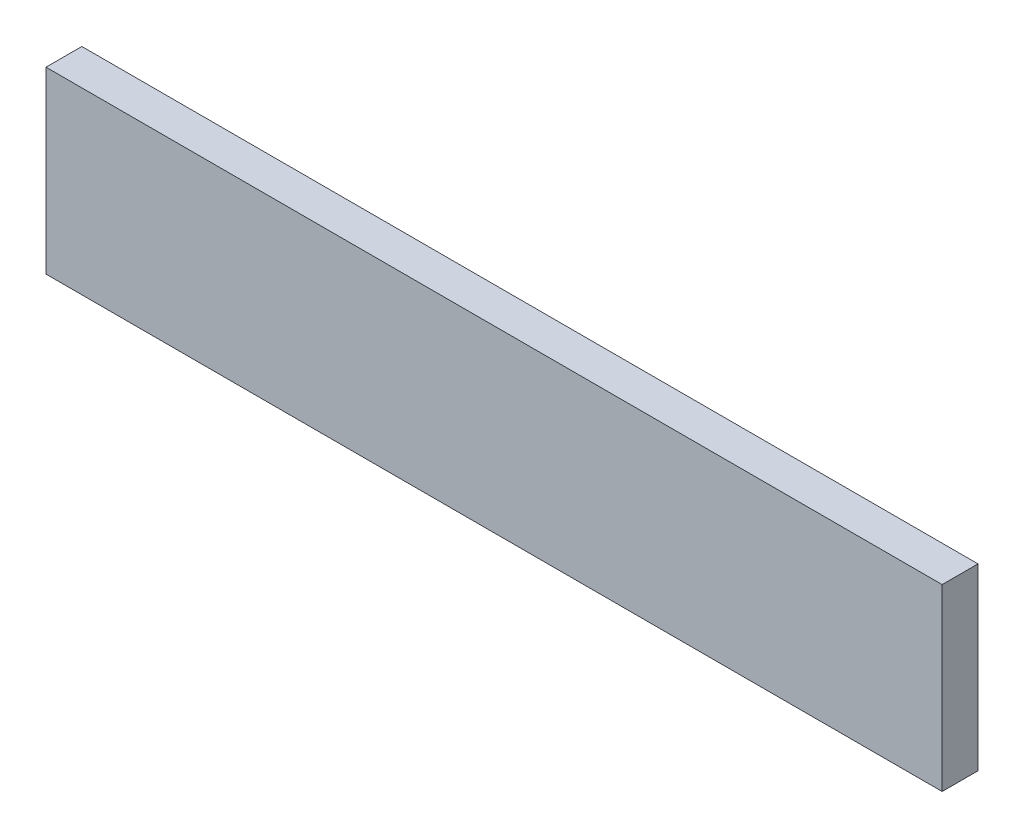
ISO-10303-21;
HEADER;
FILE_DESCRIPTION(('STEP AP214'),'2;1');
FILE_NAME('part.step','',(''),(''),'','','');
FILE_SCHEMA(('AUTOMOTIVE_DESIGN { 1 0 10303 214 1 1 1 1 }'));
ENDSEC;
DATA;
#1=APPLICATION_CONTEXT('core data for automotive mechanical design processes');
#2=APPLICATION_PROTOCOL_DEFINITION('international standard','automotive_design',2000,#1);
#3=PRODUCT_CONTEXT('',#1,'mechanical');
#4=PRODUCT('Part','Part','',(#3));
#5=PRODUCT_RELATED_PRODUCT_CATEGORY('part','',(#4));
#6=PRODUCT_DEFINITION_FORMATION('','',#4);
#7=PRODUCT_DEFINITION_CONTEXT('part definition',#1,'design');
#8=PRODUCT_DEFINITION('design','',#6,#7);
#9=PRODUCT_DEFINITION_SHAPE('','',#8);
#10=(LENGTH_UNIT() NAMED_UNIT(*) SI_UNIT(.MILLI.,.METRE.));
#11=(NAMED_UNIT(*) PLANE_ANGLE_UNIT() SI_UNIT($,.RADIAN.));
#12=(NAMED_UNIT(*) SI_UNIT($,.STERADIAN.) SOLID_ANGLE_UNIT());
#13=UNCERTAINTY_MEASURE_WITH_UNIT(LENGTH_MEASURE(1.E-05),#10,'distance_accuracy_value','');
#14=(GEOMETRIC_REPRESENTATION_CONTEXT(3) GLOBAL_UNCERTAINTY_ASSIGNED_CONTEXT((#13)) GLOBAL_UNIT_ASSIGNED_CONTEXT((#10,
#11,#12)) REPRESENTATION_CONTEXT('',''));
#15=CARTESIAN_POINT('',(0.,0.,0.));
#16=DIRECTION('',(0.,0.,1.));
#17=DIRECTION('',(1.,0.,0.));
#18=AXIS2_PLACEMENT_3D('',#15,#16,#17);
#19=CARTESIAN_POINT('',(-74.5635879648302,61.2942486085343,20.));
#20=DIRECTION('',(1.,0.,0.));
#21=DIRECTION('',(0.,0.,-1.));
#22=AXIS2_PLACEMENT_3D('',#19,#20,#21);
#23=PLANE('',#22);
#24=DIRECTION('',(0.,-1.,0.));
#25=VECTOR('',#24,1.);
#26=CARTESIAN_POINT('',(-74.5635879648302,61.2942486085343,0.));
#27=LINE('',#26,#25);
#28=CARTESIAN_POINT('',(-74.5635879648302,61.2942486085343,0.));
#29=VERTEX_POINT('',#28);
#30=CARTESIAN_POINT('',(-74.5635879648302,-38.7057513914657,0.));
#31=VERTEX_POINT('',#30);
#32=EDGE_CURVE('E96',#29,#31,#27,.T.);
#33=ORIENTED_EDGE('',*,*,#32,.T.);
#34=DIRECTION('',(0.,0.,-1.));
#35=VECTOR('',#34,1.);
#36=CARTESIAN_POINT('',(-74.5635879648302,-38.7057513914657,20.));
#37=LINE('',#36,#35);
#38=CARTESIAN_POINT('',(-74.5635879648302,-38.7057513914657,20.));
#39=VERTEX_POINT('',#38);
#40=EDGE_CURVE('E11',#39,#31,#37,.T.);
#41=ORIENTED_EDGE('',*,*,#40,.F.);
#42=DIRECTION('',(0.,-1.,0.));
#43=VECTOR('',#42,1.);
#44=CARTESIAN_POINT('',(-74.5635879648302,61.2942486085343,20.));
#45=LINE('',#44,#43);
#46=CARTESIAN_POINT('',(-74.5635879648302,61.2942486085343,20.));
#47=VERTEX_POINT('',#46);
#48=EDGE_CURVE('E84',#47,#39,#45,.T.);
#49=ORIENTED_EDGE('',*,*,#48,.F.);
#50=DIRECTION('',(0.,0.,-1.));
#51=VECTOR('',#50,1.);
#52=CARTESIAN_POINT('',(-74.5635879648302,61.2942486085343,20.));
#53=LINE('',#52,#51);
#54=EDGE_CURVE('E92',#47,#29,#53,.T.);
#55=ORIENTED_EDGE('',*,*,#54,.T.);
#56=EDGE_LOOP('',(#33,#41,#49,#55));
#57=FACE_BOUND('',#56,.T.);
#58=ADVANCED_FACE('F33',(#57),#23,.F.);
#59=CARTESIAN_POINT('',(-74.5635879648302,-38.7057513914657,20.));
#60=DIRECTION('',(0.,1.,0.));
#61=DIRECTION('',(0.,0.,1.));
#62=AXIS2_PLACEMENT_3D('',#59,#60,#61);
#63=PLANE('',#62);
#64=DIRECTION('',(1.,0.,0.));
#65=VECTOR('',#64,1.);
#66=CARTESIAN_POINT('',(-74.5635879648302,-38.7057513914657,0.));
#67=LINE('',#66,#65);
#68=CARTESIAN_POINT('',(425.43641203517,-38.7057513914657,0.));
#69=VERTEX_POINT('',#68);
#70=EDGE_CURVE('E88',#31,#69,#67,.T.);
#71=ORIENTED_EDGE('',*,*,#70,.T.);
#72=DIRECTION('',(0.,0.,-1.));
#73=VECTOR('',#72,1.);
#74=CARTESIAN_POINT('',(425.43641203517,-38.7057513914657,20.));
#75=LINE('',#74,#73);
#76=CARTESIAN_POINT('',(425.43641203517,-38.7057513914657,20.));
#77=VERTEX_POINT('',#76);
#78=EDGE_CURVE('E41',#77,#69,#75,.T.);
#79=ORIENTED_EDGE('',*,*,#78,.F.);
#80=DIRECTION('',(1.,0.,0.));
#81=VECTOR('',#80,1.);
#82=CARTESIAN_POINT('',(-74.5635879648302,-38.7057513914657,20.));
#83=LINE('',#82,#81);
#84=EDGE_CURVE('E79',#39,#77,#83,.T.);
#85=ORIENTED_EDGE('',*,*,#84,.F.);
#86=ORIENTED_EDGE('',*,*,#40,.T.);
#87=EDGE_LOOP('',(#71,#79,#85,#86));
#88=FACE_BOUND('',#87,.T.);
#89=ADVANCED_FACE('F87',(#88),#63,.F.);
#90=CARTESIAN_POINT('',(425.43641203517,61.2942486085343,20.));
#91=DIRECTION('',(-1.,0.,0.));
#92=DIRECTION('',(0.,0.,1.));
#93=AXIS2_PLACEMENT_3D('',#90,#91,#92);
#94=PLANE('',#93);
#95=DIRECTION('',(0.,1.,0.));
#96=VECTOR('',#95,1.);
#97=CARTESIAN_POINT('',(425.43641203517,61.2942486085343,0.));
#98=LINE('',#97,#96);
#99=CARTESIAN_POINT('',(425.43641203517,61.2942486085343,0.));
#100=VERTEX_POINT('',#99);
#101=EDGE_CURVE('E66',#69,#100,#98,.T.);
#102=ORIENTED_EDGE('',*,*,#101,.T.);
#103=DIRECTION('',(0.,0.,-1.));
#104=VECTOR('',#103,1.);
#105=CARTESIAN_POINT('',(425.43641203517,61.2942486085343,20.));
#106=LINE('',#105,#104);
#107=CARTESIAN_POINT('',(425.43641203517,61.2942486085343,20.));
#108=VERTEX_POINT('',#107);
#109=EDGE_CURVE('E89',#108,#100,#106,.T.);
#110=ORIENTED_EDGE('',*,*,#109,.F.);
#111=DIRECTION('',(0.,1.,0.));
#112=VECTOR('',#111,1.);
#113=CARTESIAN_POINT('',(425.43641203517,61.2942486085343,20.));
#114=LINE('',#113,#112);
#115=EDGE_CURVE('E82',#77,#108,#114,.T.);
#116=ORIENTED_EDGE('',*,*,#115,.F.);
#117=ORIENTED_EDGE('',*,*,#78,.T.);
#118=EDGE_LOOP('',(#102,#110,#116,#117));
#119=FACE_BOUND('',#118,.T.);
#120=ADVANCED_FACE('F90',(#119),#94,.F.);
#121=CARTESIAN_POINT('',(-74.5635879648302,61.2942486085343,20.));
#122=DIRECTION('',(0.,-1.,0.));
#123=DIRECTION('',(0.,0.,-1.));
#124=AXIS2_PLACEMENT_3D('',#121,#122,#123);
#125=PLANE('',#124);
#126=DIRECTION('',(-1.,0.,0.));
#127=VECTOR('',#126,1.);
#128=CARTESIAN_POINT('',(-74.5635879648302,61.2942486085343,0.));
#129=LINE('',#128,#127);
#130=EDGE_CURVE('E72',#100,#29,#129,.T.);
#131=ORIENTED_EDGE('',*,*,#130,.T.);
#132=ORIENTED_EDGE('',*,*,#54,.F.);
#133=DIRECTION('',(-1.,0.,0.));
#134=VECTOR('',#133,1.);
#135=CARTESIAN_POINT('',(-74.5635879648302,61.2942486085343,20.));
#136=LINE('',#135,#134);
#137=EDGE_CURVE('E49',#108,#47,#136,.T.);
#138=ORIENTED_EDGE('',*,*,#137,.F.);
#139=ORIENTED_EDGE('',*,*,#109,.T.);
#140=EDGE_LOOP('',(#131,#132,#138,#139));
#141=FACE_BOUND('',#140,.T.);
#142=ADVANCED_FACE('F103',(#141),#125,.F.);
#143=CARTESIAN_POINT('',(0.,0.,20.));
#144=DIRECTION('',(0.,0.,1.));
#145=DIRECTION('',(1.,0.,0.));
#146=AXIS2_PLACEMENT_3D('',#143,#144,#145);
#147=PLANE('',#146);
#148=ORIENTED_EDGE('',*,*,#48,.T.);
#149=ORIENTED_EDGE('',*,*,#84,.T.);
#150=ORIENTED_EDGE('',*,*,#115,.T.);
#151=ORIENTED_EDGE('',*,*,#137,.T.);
#152=EDGE_LOOP('',(#148,#149,#150,#151));
#153=FACE_BOUND('',#152,.T.);
#154=ADVANCED_FACE('F80',(#153),#147,.T.);
#155=CARTESIAN_POINT('',(0.,0.,0.));
#156=DIRECTION('',(0.,0.,1.));
#157=DIRECTION('',(1.,0.,0.));
#158=AXIS2_PLACEMENT_3D('',#155,#156,#157);
#159=PLANE('',#158);
#160=ORIENTED_EDGE('',*,*,#32,.F.);
#161=ORIENTED_EDGE('',*,*,#130,.F.);
#162=ORIENTED_EDGE('',*,*,#101,.F.);
#163=ORIENTED_EDGE('',*,*,#70,.F.);
#164=EDGE_LOOP('',(#160,#161,#162,#163));
#165=FACE_BOUND('',#164,.T.);
#166=ADVANCED_FACE('F106',(#165),#159,.F.);
#167=CLOSED_SHELL('',(#58,#89,#120,#142,#154,#166));
#168=MANIFOLD_SOLID_BREP('B2',#167);
#169=ADVANCED_BREP_SHAPE_REPRESENTATION('',(#18,#168),#14);
#170=SHAPE_DEFINITION_REPRESENTATION(#9,#169);
ENDSEC;
END-ISO-10303-21;
